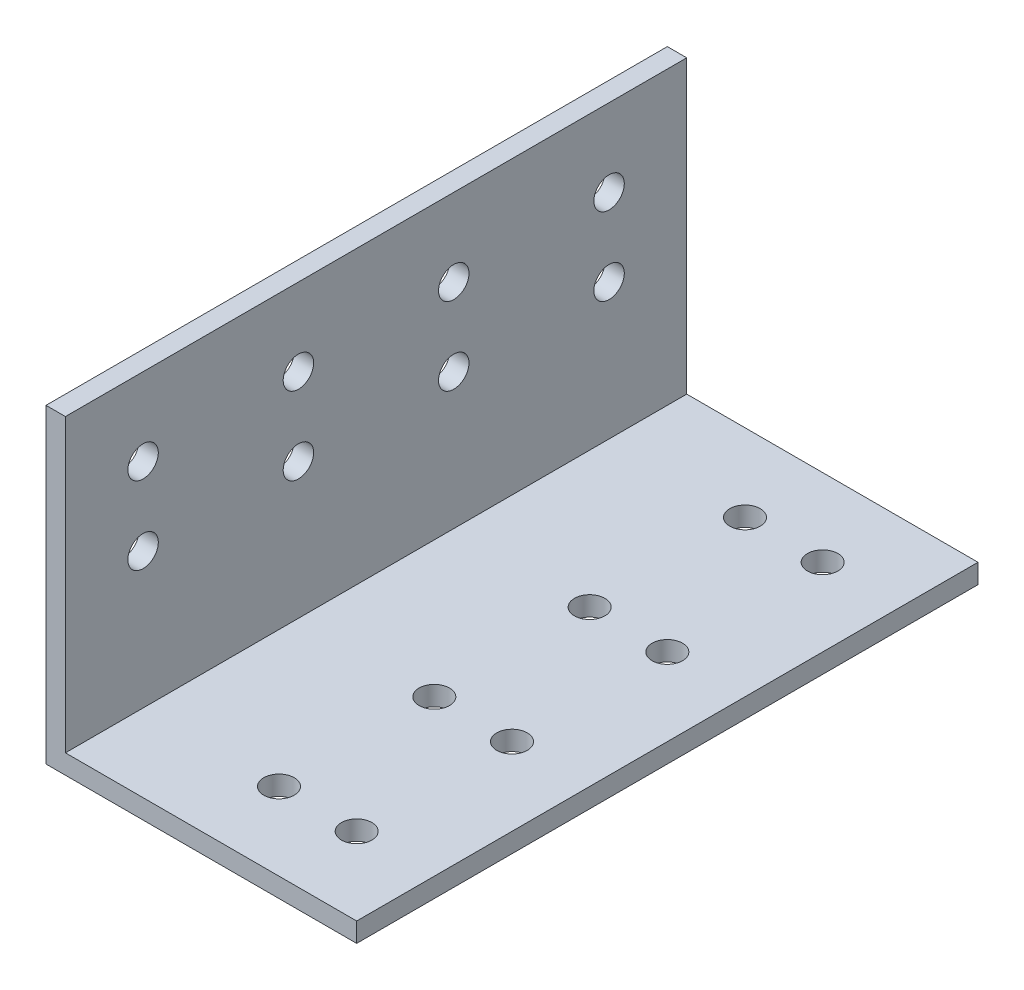
ISO-10303-21;
HEADER;
FILE_DESCRIPTION(('STEP AP214'),'2;1');
FILE_NAME('part.step','',(''),(''),'','','');
FILE_SCHEMA(('AUTOMOTIVE_DESIGN { 1 0 10303 214 1 1 1 1 }'));
ENDSEC;
DATA;
#1=APPLICATION_CONTEXT('core data for automotive mechanical design processes');
#2=APPLICATION_PROTOCOL_DEFINITION('international standard','automotive_design',2000,#1);
#3=PRODUCT_CONTEXT('',#1,'mechanical');
#4=PRODUCT('Part','Part','',(#3));
#5=PRODUCT_RELATED_PRODUCT_CATEGORY('part','',(#4));
#6=PRODUCT_DEFINITION_FORMATION('','',#4);
#7=PRODUCT_DEFINITION_CONTEXT('part definition',#1,'design');
#8=PRODUCT_DEFINITION('design','',#6,#7);
#9=PRODUCT_DEFINITION_SHAPE('','',#8);
#10=(LENGTH_UNIT() NAMED_UNIT(*) SI_UNIT(.MILLI.,.METRE.));
#11=(NAMED_UNIT(*) PLANE_ANGLE_UNIT() SI_UNIT($,.RADIAN.));
#12=(NAMED_UNIT(*) SI_UNIT($,.STERADIAN.) SOLID_ANGLE_UNIT());
#13=UNCERTAINTY_MEASURE_WITH_UNIT(LENGTH_MEASURE(1.E-05),#10,'distance_accuracy_value','');
#14=(GEOMETRIC_REPRESENTATION_CONTEXT(3) GLOBAL_UNCERTAINTY_ASSIGNED_CONTEXT((#13)) GLOBAL_UNIT_ASSIGNED_CONTEXT((#10,
#11,#12)) REPRESENTATION_CONTEXT('',''));
#15=CARTESIAN_POINT('',(0.,0.,0.));
#16=DIRECTION('',(0.,0.,1.));
#17=DIRECTION('',(1.,0.,0.));
#18=AXIS2_PLACEMENT_3D('',#15,#16,#17);
#19=CARTESIAN_POINT('',(0.,50.8,101.6));
#20=DIRECTION('',(0.,1.,0.));
#21=DIRECTION('',(0.,0.,1.));
#22=AXIS2_PLACEMENT_3D('',#19,#20,#21);
#23=PLANE('',#22);
#24=DIRECTION('',(1.,0.,0.));
#25=VECTOR('',#24,1.);
#26=CARTESIAN_POINT('',(0.,50.8,0.));
#27=LINE('',#26,#25);
#28=CARTESIAN_POINT('',(0.,50.8,0.));
#29=VERTEX_POINT('',#28);
#30=CARTESIAN_POINT('',(3.175,50.8,0.));
#31=VERTEX_POINT('',#30);
#32=EDGE_CURVE('E128',#29,#31,#27,.T.);
#33=ORIENTED_EDGE('',*,*,#32,.F.);
#34=DIRECTION('',(0.,0.,-1.));
#35=VECTOR('',#34,1.);
#36=CARTESIAN_POINT('',(0.,50.8,101.6));
#37=LINE('',#36,#35);
#38=CARTESIAN_POINT('',(0.,50.8,101.6));
#39=VERTEX_POINT('',#38);
#40=EDGE_CURVE('E11',#39,#29,#37,.T.);
#41=ORIENTED_EDGE('',*,*,#40,.F.);
#42=DIRECTION('',(1.,0.,0.));
#43=VECTOR('',#42,1.);
#44=CARTESIAN_POINT('',(0.,50.8,101.6));
#45=LINE('',#44,#43);
#46=CARTESIAN_POINT('',(3.175,50.8,101.6));
#47=VERTEX_POINT('',#46);
#48=EDGE_CURVE('E149',#39,#47,#45,.T.);
#49=ORIENTED_EDGE('',*,*,#48,.T.);
#50=DIRECTION('',(0.,0.,-1.));
#51=VECTOR('',#50,1.);
#52=CARTESIAN_POINT('',(3.175,50.8,101.6));
#53=LINE('',#52,#51);
#54=EDGE_CURVE('E39',#47,#31,#53,.T.);
#55=ORIENTED_EDGE('',*,*,#54,.T.);
#56=EDGE_LOOP('',(#33,#41,#49,#55));
#57=FACE_BOUND('',#56,.T.);
#58=ADVANCED_FACE('F36',(#57),#23,.T.);
#59=CARTESIAN_POINT('',(0.,0.,101.6));
#60=DIRECTION('',(-1.,0.,0.));
#61=DIRECTION('',(0.,0.,1.));
#62=AXIS2_PLACEMENT_3D('',#59,#60,#61);
#63=PLANE('',#62);
#64=CARTESIAN_POINT('',(0.,38.0999999999998,38.1));
#65=DIRECTION('',(1.,0.,0.));
#66=DIRECTION('',(0.,1.,0.));
#67=AXIS2_PLACEMENT_3D('',#64,#65,#66);
#68=CIRCLE('',#67,2.4892);
#69=CARTESIAN_POINT('',(0.,40.5891999999998,38.1));
#70=VERTEX_POINT('',#69);
#71=EDGE_CURVE('E426',#70,#70,#68,.T.);
#72=ORIENTED_EDGE('',*,*,#71,.T.);
#73=EDGE_LOOP('',(#72));
#74=FACE_BOUND('',#73,.T.);
#75=CARTESIAN_POINT('',(0.,25.3999999999995,88.9));
#76=DIRECTION('',(1.,0.,0.));
#77=DIRECTION('',(0.,1.,0.));
#78=AXIS2_PLACEMENT_3D('',#75,#76,#77);
#79=CIRCLE('',#78,2.48920000000002);
#80=CARTESIAN_POINT('',(0.,27.8891999999995,88.9));
#81=VERTEX_POINT('',#80);
#82=EDGE_CURVE('E420',#81,#81,#79,.T.);
#83=ORIENTED_EDGE('',*,*,#82,.T.);
#84=EDGE_LOOP('',(#83));
#85=FACE_BOUND('',#84,.T.);
#86=CARTESIAN_POINT('',(0.,25.3999999999996,63.5));
#87=DIRECTION('',(1.,0.,0.));
#88=DIRECTION('',(0.,1.,0.));
#89=AXIS2_PLACEMENT_3D('',#86,#87,#88);
#90=CIRCLE('',#89,2.4892);
#91=CARTESIAN_POINT('',(0.,27.8891999999996,63.5));
#92=VERTEX_POINT('',#91);
#93=EDGE_CURVE('E433',#92,#92,#90,.T.);
#94=ORIENTED_EDGE('',*,*,#93,.T.);
#95=EDGE_LOOP('',(#94));
#96=FACE_BOUND('',#95,.T.);
#97=CARTESIAN_POINT('',(0.,25.3999999999998,38.1));
#98=DIRECTION('',(1.,0.,0.));
#99=DIRECTION('',(0.,1.,0.));
#100=AXIS2_PLACEMENT_3D('',#97,#98,#99);
#101=CIRCLE('',#100,2.4892);
#102=CARTESIAN_POINT('',(0.,27.8891999999998,38.1));
#103=VERTEX_POINT('',#102);
#104=EDGE_CURVE('E222',#103,#103,#101,.T.);
#105=ORIENTED_EDGE('',*,*,#104,.T.);
#106=EDGE_LOOP('',(#105));
#107=FACE_BOUND('',#106,.T.);
#108=CARTESIAN_POINT('',(0.,38.0999999999996,63.5));
#109=DIRECTION('',(1.,0.,0.));
#110=DIRECTION('',(0.,1.,0.));
#111=AXIS2_PLACEMENT_3D('',#108,#109,#110);
#112=CIRCLE('',#111,2.4892);
#113=CARTESIAN_POINT('',(0.,40.5891999999996,63.5));
#114=VERTEX_POINT('',#113);
#115=EDGE_CURVE('E401',#114,#114,#112,.T.);
#116=ORIENTED_EDGE('',*,*,#115,.T.);
#117=EDGE_LOOP('',(#116));
#118=FACE_BOUND('',#117,.T.);
#119=CARTESIAN_POINT('',(0.,38.0999999999995,88.9));
#120=DIRECTION('',(1.,0.,0.));
#121=DIRECTION('',(0.,1.,0.));
#122=AXIS2_PLACEMENT_3D('',#119,#120,#121);
#123=CIRCLE('',#122,2.48920000000002);
#124=CARTESIAN_POINT('',(0.,40.5891999999995,88.9));
#125=VERTEX_POINT('',#124);
#126=EDGE_CURVE('E403',#125,#125,#123,.T.);
#127=ORIENTED_EDGE('',*,*,#126,.T.);
#128=EDGE_LOOP('',(#127));
#129=FACE_BOUND('',#128,.T.);
#130=CARTESIAN_POINT('',(0.,38.1,12.7));
#131=DIRECTION('',(1.,0.,0.));
#132=DIRECTION('',(0.,1.,0.));
#133=AXIS2_PLACEMENT_3D('',#130,#131,#132);
#134=CIRCLE('',#133,2.4892);
#135=CARTESIAN_POINT('',(0.,40.5892,12.7));
#136=VERTEX_POINT('',#135);
#137=EDGE_CURVE('E414',#136,#136,#134,.T.);
#138=ORIENTED_EDGE('',*,*,#137,.T.);
#139=EDGE_LOOP('',(#138));
#140=FACE_BOUND('',#139,.T.);
#141=CARTESIAN_POINT('',(0.,25.4,12.7));
#142=DIRECTION('',(1.,0.,0.));
#143=DIRECTION('',(0.,1.,0.));
#144=AXIS2_PLACEMENT_3D('',#141,#142,#143);
#145=CIRCLE('',#144,2.4892);
#146=CARTESIAN_POINT('',(0.,27.8892,12.7));
#147=VERTEX_POINT('',#146);
#148=EDGE_CURVE('E221',#147,#147,#145,.T.);
#149=ORIENTED_EDGE('',*,*,#148,.T.);
#150=EDGE_LOOP('',(#149));
#151=FACE_BOUND('',#150,.T.);
#152=DIRECTION('',(0.,1.,0.));
#153=VECTOR('',#152,1.);
#154=CARTESIAN_POINT('',(0.,0.,0.));
#155=LINE('',#154,#153);
#156=CARTESIAN_POINT('',(0.,0.,0.));
#157=VERTEX_POINT('',#156);
#158=EDGE_CURVE('E146',#157,#29,#155,.T.);
#159=ORIENTED_EDGE('',*,*,#158,.F.);
#160=DIRECTION('',(0.,0.,-1.));
#161=VECTOR('',#160,1.);
#162=CARTESIAN_POINT('',(0.,0.,101.6));
#163=LINE('',#162,#161);
#164=CARTESIAN_POINT('',(0.,0.,101.6));
#165=VERTEX_POINT('',#164);
#166=EDGE_CURVE('E46',#165,#157,#163,.T.);
#167=ORIENTED_EDGE('',*,*,#166,.F.);
#168=DIRECTION('',(0.,1.,0.));
#169=VECTOR('',#168,1.);
#170=CARTESIAN_POINT('',(0.,0.,101.6));
#171=LINE('',#170,#169);
#172=EDGE_CURVE('E113',#165,#39,#171,.T.);
#173=ORIENTED_EDGE('',*,*,#172,.T.);
#174=ORIENTED_EDGE('',*,*,#40,.T.);
#175=EDGE_LOOP('',(#159,#167,#173,#174));
#176=FACE_BOUND('',#175,.T.);
#177=ADVANCED_FACE('F163',(#74,#85,#96,#107,#118,#129,#140,#151,#176),#63,.T.);
#178=CARTESIAN_POINT('',(50.8,0.,101.6));
#179=DIRECTION('',(0.,-1.,0.));
#180=DIRECTION('',(1.,0.,0.));
#181=AXIS2_PLACEMENT_3D('',#178,#179,#180);
#182=PLANE('',#181);
#183=CARTESIAN_POINT('',(25.4,0.,88.9000000000002));
#184=DIRECTION('',(0.,1.,0.));
#185=DIRECTION('',(-1.,0.,0.));
#186=AXIS2_PLACEMENT_3D('',#183,#184,#185);
#187=CIRCLE('',#186,2.4892);
#188=CARTESIAN_POINT('',(22.9108,0.,88.9000000000002));
#189=VERTEX_POINT('',#188);
#190=EDGE_CURVE('E283',#189,#189,#187,.T.);
#191=ORIENTED_EDGE('',*,*,#190,.T.);
#192=EDGE_LOOP('',(#191));
#193=FACE_BOUND('',#192,.T.);
#194=CARTESIAN_POINT('',(25.4,0.,63.5000000000002));
#195=DIRECTION('',(0.,1.,0.));
#196=DIRECTION('',(-1.,0.,0.));
#197=AXIS2_PLACEMENT_3D('',#194,#195,#196);
#198=CIRCLE('',#197,2.4892);
#199=CARTESIAN_POINT('',(22.9108,0.,63.5000000000002));
#200=VERTEX_POINT('',#199);
#201=EDGE_CURVE('E275',#200,#200,#198,.T.);
#202=ORIENTED_EDGE('',*,*,#201,.T.);
#203=EDGE_LOOP('',(#202));
#204=FACE_BOUND('',#203,.T.);
#205=CARTESIAN_POINT('',(25.4,0.,38.1000000000002));
#206=DIRECTION('',(0.,1.,0.));
#207=DIRECTION('',(-1.,0.,0.));
#208=AXIS2_PLACEMENT_3D('',#205,#206,#207);
#209=CIRCLE('',#208,2.4892);
#210=CARTESIAN_POINT('',(22.9108,0.,38.1000000000002));
#211=VERTEX_POINT('',#210);
#212=EDGE_CURVE('E267',#211,#211,#209,.T.);
#213=ORIENTED_EDGE('',*,*,#212,.T.);
#214=EDGE_LOOP('',(#213));
#215=FACE_BOUND('',#214,.T.);
#216=CARTESIAN_POINT('',(38.1,0.,88.9));
#217=DIRECTION('',(0.,1.,0.));
#218=DIRECTION('',(-1.,0.,0.));
#219=AXIS2_PLACEMENT_3D('',#216,#217,#218);
#220=CIRCLE('',#219,2.4892);
#221=CARTESIAN_POINT('',(35.6108,0.,88.9));
#222=VERTEX_POINT('',#221);
#223=EDGE_CURVE('E259',#222,#222,#220,.T.);
#224=ORIENTED_EDGE('',*,*,#223,.T.);
#225=EDGE_LOOP('',(#224));
#226=FACE_BOUND('',#225,.T.);
#227=CARTESIAN_POINT('',(38.1,0.,63.5));
#228=DIRECTION('',(0.,1.,0.));
#229=DIRECTION('',(-1.,0.,0.));
#230=AXIS2_PLACEMENT_3D('',#227,#228,#229);
#231=CIRCLE('',#230,2.4892);
#232=CARTESIAN_POINT('',(35.6108,0.,63.5));
#233=VERTEX_POINT('',#232);
#234=EDGE_CURVE('E251',#233,#233,#231,.T.);
#235=ORIENTED_EDGE('',*,*,#234,.T.);
#236=EDGE_LOOP('',(#235));
#237=FACE_BOUND('',#236,.T.);
#238=CARTESIAN_POINT('',(38.1,0.,38.1));
#239=DIRECTION('',(0.,1.,0.));
#240=DIRECTION('',(-1.,0.,0.));
#241=AXIS2_PLACEMENT_3D('',#238,#239,#240);
#242=CIRCLE('',#241,2.4892);
#243=CARTESIAN_POINT('',(35.6108,0.,38.1));
#244=VERTEX_POINT('',#243);
#245=EDGE_CURVE('E243',#244,#244,#242,.T.);
#246=ORIENTED_EDGE('',*,*,#245,.T.);
#247=EDGE_LOOP('',(#246));
#248=FACE_BOUND('',#247,.T.);
#249=CARTESIAN_POINT('',(38.1,0.,12.7));
#250=DIRECTION('',(0.,1.,0.));
#251=DIRECTION('',(-1.,0.,0.));
#252=AXIS2_PLACEMENT_3D('',#249,#250,#251);
#253=CIRCLE('',#252,2.4892);
#254=CARTESIAN_POINT('',(35.6108,0.,12.7));
#255=VERTEX_POINT('',#254);
#256=EDGE_CURVE('E234',#255,#255,#253,.T.);
#257=ORIENTED_EDGE('',*,*,#256,.T.);
#258=EDGE_LOOP('',(#257));
#259=FACE_BOUND('',#258,.T.);
#260=CARTESIAN_POINT('',(25.4,0.,12.7000000000002));
#261=DIRECTION('',(0.,1.,0.));
#262=DIRECTION('',(-1.,0.,0.));
#263=AXIS2_PLACEMENT_3D('',#260,#261,#262);
#264=CIRCLE('',#263,2.4892);
#265=CARTESIAN_POINT('',(22.9108,0.,12.7000000000002));
#266=VERTEX_POINT('',#265);
#267=EDGE_CURVE('E133',#266,#266,#264,.T.);
#268=ORIENTED_EDGE('',*,*,#267,.T.);
#269=EDGE_LOOP('',(#268));
#270=FACE_BOUND('',#269,.T.);
#271=DIRECTION('',(-1.,0.,0.));
#272=VECTOR('',#271,1.);
#273=CARTESIAN_POINT('',(50.8,0.,0.));
#274=LINE('',#273,#272);
#275=CARTESIAN_POINT('',(50.8,0.,0.));
#276=VERTEX_POINT('',#275);
#277=EDGE_CURVE('E99',#276,#157,#274,.T.);
#278=ORIENTED_EDGE('',*,*,#277,.F.);
#279=DIRECTION('',(0.,0.,-1.));
#280=VECTOR('',#279,1.);
#281=CARTESIAN_POINT('',(50.8,0.,101.6));
#282=LINE('',#281,#280);
#283=CARTESIAN_POINT('',(50.8,0.,101.6));
#284=VERTEX_POINT('',#283);
#285=EDGE_CURVE('E94',#284,#276,#282,.T.);
#286=ORIENTED_EDGE('',*,*,#285,.F.);
#287=DIRECTION('',(-1.,0.,0.));
#288=VECTOR('',#287,1.);
#289=CARTESIAN_POINT('',(50.8,0.,101.6));
#290=LINE('',#289,#288);
#291=EDGE_CURVE('E97',#284,#165,#290,.T.);
#292=ORIENTED_EDGE('',*,*,#291,.T.);
#293=ORIENTED_EDGE('',*,*,#166,.T.);
#294=EDGE_LOOP('',(#278,#286,#292,#293));
#295=FACE_BOUND('',#294,.T.);
#296=ADVANCED_FACE('F96',(#193,#204,#215,#226,#237,#248,#259,#270,#295),#182,.T.);
#297=CARTESIAN_POINT('',(50.8,3.175,101.6));
#298=DIRECTION('',(1.,0.,0.));
#299=DIRECTION('',(0.,0.,-1.));
#300=AXIS2_PLACEMENT_3D('',#297,#298,#299);
#301=PLANE('',#300);
#302=DIRECTION('',(0.,-1.,0.));
#303=VECTOR('',#302,1.);
#304=CARTESIAN_POINT('',(50.8,3.175,0.));
#305=LINE('',#304,#303);
#306=CARTESIAN_POINT('',(50.8,3.175,0.));
#307=VERTEX_POINT('',#306);
#308=EDGE_CURVE('E141',#307,#276,#305,.T.);
#309=ORIENTED_EDGE('',*,*,#308,.F.);
#310=DIRECTION('',(0.,0.,-1.));
#311=VECTOR('',#310,1.);
#312=CARTESIAN_POINT('',(50.8,3.175,101.6));
#313=LINE('',#312,#311);
#314=CARTESIAN_POINT('',(50.8,3.175,101.6));
#315=VERTEX_POINT('',#314);
#316=EDGE_CURVE('E105',#315,#307,#313,.T.);
#317=ORIENTED_EDGE('',*,*,#316,.F.);
#318=DIRECTION('',(0.,-1.,0.));
#319=VECTOR('',#318,1.);
#320=CARTESIAN_POINT('',(50.8,3.175,101.6));
#321=LINE('',#320,#319);
#322=EDGE_CURVE('E111',#315,#284,#321,.T.);
#323=ORIENTED_EDGE('',*,*,#322,.T.);
#324=ORIENTED_EDGE('',*,*,#285,.T.);
#325=EDGE_LOOP('',(#309,#317,#323,#324));
#326=FACE_BOUND('',#325,.T.);
#327=ADVANCED_FACE('F116',(#326),#301,.T.);
#328=CARTESIAN_POINT('',(3.175,3.175,101.6));
#329=DIRECTION('',(0.,1.,0.));
#330=DIRECTION('',(-1.,0.,0.));
#331=AXIS2_PLACEMENT_3D('',#328,#329,#330);
#332=PLANE('',#331);
#333=CARTESIAN_POINT('',(25.4,3.175,88.9000000000002));
#334=DIRECTION('',(0.,1.,0.));
#335=DIRECTION('',(-1.,0.,0.));
#336=AXIS2_PLACEMENT_3D('',#333,#334,#335);
#337=CIRCLE('',#336,2.4892);
#338=CARTESIAN_POINT('',(22.9108,3.175,88.9000000000002));
#339=VERTEX_POINT('',#338);
#340=EDGE_CURVE('E228',#339,#339,#337,.T.);
#341=ORIENTED_EDGE('',*,*,#340,.F.);
#342=EDGE_LOOP('',(#341));
#343=FACE_BOUND('',#342,.T.);
#344=CARTESIAN_POINT('',(25.4,3.175,63.5000000000002));
#345=DIRECTION('',(0.,1.,0.));
#346=DIRECTION('',(-1.,0.,0.));
#347=AXIS2_PLACEMENT_3D('',#344,#345,#346);
#348=CIRCLE('',#347,2.4892);
#349=CARTESIAN_POINT('',(22.9108,3.175,63.5000000000002));
#350=VERTEX_POINT('',#349);
#351=EDGE_CURVE('E279',#350,#350,#348,.T.);
#352=ORIENTED_EDGE('',*,*,#351,.F.);
#353=EDGE_LOOP('',(#352));
#354=FACE_BOUND('',#353,.T.);
#355=CARTESIAN_POINT('',(25.4,3.175,38.1000000000002));
#356=DIRECTION('',(0.,1.,0.));
#357=DIRECTION('',(-1.,0.,0.));
#358=AXIS2_PLACEMENT_3D('',#355,#356,#357);
#359=CIRCLE('',#358,2.4892);
#360=CARTESIAN_POINT('',(22.9108,3.175,38.1000000000002));
#361=VERTEX_POINT('',#360);
#362=EDGE_CURVE('E271',#361,#361,#359,.T.);
#363=ORIENTED_EDGE('',*,*,#362,.F.);
#364=EDGE_LOOP('',(#363));
#365=FACE_BOUND('',#364,.T.);
#366=CARTESIAN_POINT('',(38.1,3.175,88.9));
#367=DIRECTION('',(0.,1.,0.));
#368=DIRECTION('',(-1.,0.,0.));
#369=AXIS2_PLACEMENT_3D('',#366,#367,#368);
#370=CIRCLE('',#369,2.4892);
#371=CARTESIAN_POINT('',(35.6108,3.175,88.9));
#372=VERTEX_POINT('',#371);
#373=EDGE_CURVE('E263',#372,#372,#370,.T.);
#374=ORIENTED_EDGE('',*,*,#373,.F.);
#375=EDGE_LOOP('',(#374));
#376=FACE_BOUND('',#375,.T.);
#377=CARTESIAN_POINT('',(38.1,3.175,63.5));
#378=DIRECTION('',(0.,1.,0.));
#379=DIRECTION('',(-1.,0.,0.));
#380=AXIS2_PLACEMENT_3D('',#377,#378,#379);
#381=CIRCLE('',#380,2.4892);
#382=CARTESIAN_POINT('',(35.6108,3.175,63.5));
#383=VERTEX_POINT('',#382);
#384=EDGE_CURVE('E255',#383,#383,#381,.T.);
#385=ORIENTED_EDGE('',*,*,#384,.F.);
#386=EDGE_LOOP('',(#385));
#387=FACE_BOUND('',#386,.T.);
#388=CARTESIAN_POINT('',(38.1,3.175,38.1));
#389=DIRECTION('',(0.,1.,0.));
#390=DIRECTION('',(-1.,0.,0.));
#391=AXIS2_PLACEMENT_3D('',#388,#389,#390);
#392=CIRCLE('',#391,2.4892);
#393=CARTESIAN_POINT('',(35.6108,3.175,38.1));
#394=VERTEX_POINT('',#393);
#395=EDGE_CURVE('E247',#394,#394,#392,.T.);
#396=ORIENTED_EDGE('',*,*,#395,.F.);
#397=EDGE_LOOP('',(#396));
#398=FACE_BOUND('',#397,.T.);
#399=CARTESIAN_POINT('',(38.1,3.175,12.7));
#400=DIRECTION('',(0.,1.,0.));
#401=DIRECTION('',(-1.,0.,0.));
#402=AXIS2_PLACEMENT_3D('',#399,#400,#401);
#403=CIRCLE('',#402,2.4892);
#404=CARTESIAN_POINT('',(35.6108,3.175,12.7));
#405=VERTEX_POINT('',#404);
#406=EDGE_CURVE('E239',#405,#405,#403,.T.);
#407=ORIENTED_EDGE('',*,*,#406,.F.);
#408=EDGE_LOOP('',(#407));
#409=FACE_BOUND('',#408,.T.);
#410=CARTESIAN_POINT('',(25.4,3.175,12.7000000000002));
#411=DIRECTION('',(0.,1.,0.));
#412=DIRECTION('',(-1.,0.,0.));
#413=AXIS2_PLACEMENT_3D('',#410,#411,#412);
#414=CIRCLE('',#413,2.4892);
#415=CARTESIAN_POINT('',(22.9108,3.175,12.7000000000002));
#416=VERTEX_POINT('',#415);
#417=EDGE_CURVE('E238',#416,#416,#414,.T.);
#418=ORIENTED_EDGE('',*,*,#417,.F.);
#419=EDGE_LOOP('',(#418));
#420=FACE_BOUND('',#419,.T.);
#421=DIRECTION('',(1.,0.,0.));
#422=VECTOR('',#421,1.);
#423=CARTESIAN_POINT('',(3.175,3.175,0.));
#424=LINE('',#423,#422);
#425=CARTESIAN_POINT('',(3.175,3.175,0.));
#426=VERTEX_POINT('',#425);
#427=EDGE_CURVE('E137',#426,#307,#424,.T.);
#428=ORIENTED_EDGE('',*,*,#427,.F.);
#429=DIRECTION('',(0.,0.,-1.));
#430=VECTOR('',#429,1.);
#431=CARTESIAN_POINT('',(3.175,3.175,101.6));
#432=LINE('',#431,#430);
#433=CARTESIAN_POINT('',(3.175,3.175,101.6));
#434=VERTEX_POINT('',#433);
#435=EDGE_CURVE('E154',#434,#426,#432,.T.);
#436=ORIENTED_EDGE('',*,*,#435,.F.);
#437=DIRECTION('',(1.,0.,0.));
#438=VECTOR('',#437,1.);
#439=CARTESIAN_POINT('',(3.175,3.175,101.6));
#440=LINE('',#439,#438);
#441=EDGE_CURVE('E118',#434,#315,#440,.T.);
#442=ORIENTED_EDGE('',*,*,#441,.T.);
#443=ORIENTED_EDGE('',*,*,#316,.T.);
#444=EDGE_LOOP('',(#428,#436,#442,#443));
#445=FACE_BOUND('',#444,.T.);
#446=ADVANCED_FACE('F180',(#343,#354,#365,#376,#387,#398,#409,#420,#445),#332,.T.);
#447=CARTESIAN_POINT('',(3.175,50.8,101.6));
#448=DIRECTION('',(1.,0.,0.));
#449=DIRECTION('',(0.,1.,0.));
#450=AXIS2_PLACEMENT_3D('',#447,#448,#449);
#451=PLANE('',#450);
#452=CARTESIAN_POINT('',(3.175,38.0999999999998,38.1));
#453=DIRECTION('',(1.,0.,0.));
#454=DIRECTION('',(0.,1.,0.));
#455=AXIS2_PLACEMENT_3D('',#452,#453,#454);
#456=CIRCLE('',#455,2.4892);
#457=CARTESIAN_POINT('',(3.175,40.5891999999998,38.1));
#458=VERTEX_POINT('',#457);
#459=EDGE_CURVE('E191',#458,#458,#456,.T.);
#460=ORIENTED_EDGE('',*,*,#459,.F.);
#461=EDGE_LOOP('',(#460));
#462=FACE_BOUND('',#461,.T.);
#463=CARTESIAN_POINT('',(3.175,25.3999999999995,88.9));
#464=DIRECTION('',(1.,0.,0.));
#465=DIRECTION('',(0.,1.,0.));
#466=AXIS2_PLACEMENT_3D('',#463,#464,#465);
#467=CIRCLE('',#466,2.48920000000002);
#468=CARTESIAN_POINT('',(3.175,27.8891999999995,88.9));
#469=VERTEX_POINT('',#468);
#470=EDGE_CURVE('E195',#469,#469,#467,.T.);
#471=ORIENTED_EDGE('',*,*,#470,.F.);
#472=EDGE_LOOP('',(#471));
#473=FACE_BOUND('',#472,.T.);
#474=CARTESIAN_POINT('',(3.175,25.3999999999996,63.5));
#475=DIRECTION('',(1.,0.,0.));
#476=DIRECTION('',(0.,1.,0.));
#477=AXIS2_PLACEMENT_3D('',#474,#475,#476);
#478=CIRCLE('',#477,2.4892);
#479=CARTESIAN_POINT('',(3.175,27.8891999999996,63.5));
#480=VERTEX_POINT('',#479);
#481=EDGE_CURVE('E199',#480,#480,#478,.T.);
#482=ORIENTED_EDGE('',*,*,#481,.F.);
#483=EDGE_LOOP('',(#482));
#484=FACE_BOUND('',#483,.T.);
#485=CARTESIAN_POINT('',(3.175,25.3999999999998,38.1));
#486=DIRECTION('',(1.,0.,0.));
#487=DIRECTION('',(0.,1.,0.));
#488=AXIS2_PLACEMENT_3D('',#485,#486,#487);
#489=CIRCLE('',#488,2.4892);
#490=CARTESIAN_POINT('',(3.175,27.8891999999998,38.1));
#491=VERTEX_POINT('',#490);
#492=EDGE_CURVE('E203',#491,#491,#489,.T.);
#493=ORIENTED_EDGE('',*,*,#492,.F.);
#494=EDGE_LOOP('',(#493));
#495=FACE_BOUND('',#494,.T.);
#496=CARTESIAN_POINT('',(3.175,38.0999999999996,63.5));
#497=DIRECTION('',(1.,0.,0.));
#498=DIRECTION('',(0.,1.,0.));
#499=AXIS2_PLACEMENT_3D('',#496,#497,#498);
#500=CIRCLE('',#499,2.4892);
#501=CARTESIAN_POINT('',(3.175,40.5891999999996,63.5));
#502=VERTEX_POINT('',#501);
#503=EDGE_CURVE('E207',#502,#502,#500,.T.);
#504=ORIENTED_EDGE('',*,*,#503,.F.);
#505=EDGE_LOOP('',(#504));
#506=FACE_BOUND('',#505,.T.);
#507=CARTESIAN_POINT('',(3.175,38.0999999999995,88.9));
#508=DIRECTION('',(1.,0.,0.));
#509=DIRECTION('',(0.,1.,0.));
#510=AXIS2_PLACEMENT_3D('',#507,#508,#509);
#511=CIRCLE('',#510,2.48920000000002);
#512=CARTESIAN_POINT('',(3.175,40.5891999999995,88.9));
#513=VERTEX_POINT('',#512);
#514=EDGE_CURVE('E211',#513,#513,#511,.T.);
#515=ORIENTED_EDGE('',*,*,#514,.F.);
#516=EDGE_LOOP('',(#515));
#517=FACE_BOUND('',#516,.T.);
#518=CARTESIAN_POINT('',(3.175,38.1,12.7));
#519=DIRECTION('',(1.,0.,0.));
#520=DIRECTION('',(0.,1.,0.));
#521=AXIS2_PLACEMENT_3D('',#518,#519,#520);
#522=CIRCLE('',#521,2.4892);
#523=CARTESIAN_POINT('',(3.175,40.5892,12.7));
#524=VERTEX_POINT('',#523);
#525=EDGE_CURVE('E215',#524,#524,#522,.T.);
#526=ORIENTED_EDGE('',*,*,#525,.F.);
#527=EDGE_LOOP('',(#526));
#528=FACE_BOUND('',#527,.T.);
#529=CARTESIAN_POINT('',(3.175,25.4,12.7));
#530=DIRECTION('',(1.,0.,0.));
#531=DIRECTION('',(0.,1.,0.));
#532=AXIS2_PLACEMENT_3D('',#529,#530,#531);
#533=CIRCLE('',#532,2.4892);
#534=CARTESIAN_POINT('',(3.175,27.8892,12.7));
#535=VERTEX_POINT('',#534);
#536=EDGE_CURVE('E218',#535,#535,#533,.T.);
#537=ORIENTED_EDGE('',*,*,#536,.F.);
#538=EDGE_LOOP('',(#537));
#539=FACE_BOUND('',#538,.T.);
#540=DIRECTION('',(0.,-1.,0.));
#541=VECTOR('',#540,1.);
#542=CARTESIAN_POINT('',(3.175,50.8,0.));
#543=LINE('',#542,#541);
#544=EDGE_CURVE('E132',#31,#426,#543,.T.);
#545=ORIENTED_EDGE('',*,*,#544,.F.);
#546=ORIENTED_EDGE('',*,*,#54,.F.);
#547=DIRECTION('',(0.,-1.,0.));
#548=VECTOR('',#547,1.);
#549=CARTESIAN_POINT('',(3.175,50.8,101.6));
#550=LINE('',#549,#548);
#551=EDGE_CURVE('E122',#47,#434,#550,.T.);
#552=ORIENTED_EDGE('',*,*,#551,.T.);
#553=ORIENTED_EDGE('',*,*,#435,.T.);
#554=EDGE_LOOP('',(#545,#546,#552,#553));
#555=FACE_BOUND('',#554,.T.);
#556=ADVANCED_FACE('F160',(#462,#473,#484,#495,#506,#517,#528,#539,#555),#451,.T.);
#557=CARTESIAN_POINT('',(0.,0.,101.6));
#558=DIRECTION('',(0.,0.,-1.));
#559=DIRECTION('',(-1.,0.,0.));
#560=AXIS2_PLACEMENT_3D('',#557,#558,#559);
#561=PLANE('',#560);
#562=ORIENTED_EDGE('',*,*,#48,.F.);
#563=ORIENTED_EDGE('',*,*,#172,.F.);
#564=ORIENTED_EDGE('',*,*,#291,.F.);
#565=ORIENTED_EDGE('',*,*,#322,.F.);
#566=ORIENTED_EDGE('',*,*,#441,.F.);
#567=ORIENTED_EDGE('',*,*,#551,.F.);
#568=EDGE_LOOP('',(#562,#563,#564,#565,#566,#567));
#569=FACE_BOUND('',#568,.T.);
#570=ADVANCED_FACE('F109',(#569),#561,.F.);
#571=CARTESIAN_POINT('',(0.,0.,0.));
#572=DIRECTION('',(0.,0.,-1.));
#573=DIRECTION('',(-1.,0.,0.));
#574=AXIS2_PLACEMENT_3D('',#571,#572,#573);
#575=PLANE('',#574);
#576=ORIENTED_EDGE('',*,*,#32,.T.);
#577=ORIENTED_EDGE('',*,*,#544,.T.);
#578=ORIENTED_EDGE('',*,*,#427,.T.);
#579=ORIENTED_EDGE('',*,*,#308,.T.);
#580=ORIENTED_EDGE('',*,*,#277,.T.);
#581=ORIENTED_EDGE('',*,*,#158,.T.);
#582=EDGE_LOOP('',(#576,#577,#578,#579,#580,#581));
#583=FACE_BOUND('',#582,.T.);
#584=ADVANCED_FACE('F162',(#583),#575,.T.);
#585=CARTESIAN_POINT('',(25.4,0.,12.7000000000002));
#586=DIRECTION('',(0.,1.,0.));
#587=DIRECTION('',(-1.,0.,0.));
#588=AXIS2_PLACEMENT_3D('',#585,#586,#587);
#589=CYLINDRICAL_SURFACE('',#588,2.4892);
#590=ORIENTED_EDGE('',*,*,#267,.F.);
#591=EDGE_LOOP('',(#590));
#592=FACE_BOUND('',#591,.T.);
#593=ORIENTED_EDGE('',*,*,#417,.T.);
#594=EDGE_LOOP('',(#593));
#595=FACE_BOUND('',#594,.T.);
#596=ADVANCED_FACE('F327',(#592,#595),#589,.F.);
#597=CARTESIAN_POINT('',(38.1,0.,12.7));
#598=DIRECTION('',(0.,1.,0.));
#599=DIRECTION('',(-1.,0.,0.));
#600=AXIS2_PLACEMENT_3D('',#597,#598,#599);
#601=CYLINDRICAL_SURFACE('',#600,2.4892);
#602=ORIENTED_EDGE('',*,*,#256,.F.);
#603=EDGE_LOOP('',(#602));
#604=FACE_BOUND('',#603,.T.);
#605=ORIENTED_EDGE('',*,*,#406,.T.);
#606=EDGE_LOOP('',(#605));
#607=FACE_BOUND('',#606,.T.);
#608=ADVANCED_FACE('F330',(#604,#607),#601,.F.);
#609=CARTESIAN_POINT('',(38.1,0.,38.1));
#610=DIRECTION('',(0.,1.,0.));
#611=DIRECTION('',(-1.,0.,0.));
#612=AXIS2_PLACEMENT_3D('',#609,#610,#611);
#613=CYLINDRICAL_SURFACE('',#612,2.4892);
#614=ORIENTED_EDGE('',*,*,#245,.F.);
#615=EDGE_LOOP('',(#614));
#616=FACE_BOUND('',#615,.T.);
#617=ORIENTED_EDGE('',*,*,#395,.T.);
#618=EDGE_LOOP('',(#617));
#619=FACE_BOUND('',#618,.T.);
#620=ADVANCED_FACE('F337',(#616,#619),#613,.F.);
#621=CARTESIAN_POINT('',(38.1,0.,63.5));
#622=DIRECTION('',(0.,1.,0.));
#623=DIRECTION('',(-1.,0.,0.));
#624=AXIS2_PLACEMENT_3D('',#621,#622,#623);
#625=CYLINDRICAL_SURFACE('',#624,2.4892);
#626=ORIENTED_EDGE('',*,*,#234,.F.);
#627=EDGE_LOOP('',(#626));
#628=FACE_BOUND('',#627,.T.);
#629=ORIENTED_EDGE('',*,*,#384,.T.);
#630=EDGE_LOOP('',(#629));
#631=FACE_BOUND('',#630,.T.);
#632=ADVANCED_FACE('F358',(#628,#631),#625,.F.);
#633=CARTESIAN_POINT('',(38.1,0.,88.9));
#634=DIRECTION('',(0.,1.,0.));
#635=DIRECTION('',(-1.,0.,0.));
#636=AXIS2_PLACEMENT_3D('',#633,#634,#635);
#637=CYLINDRICAL_SURFACE('',#636,2.4892);
#638=ORIENTED_EDGE('',*,*,#223,.F.);
#639=EDGE_LOOP('',(#638));
#640=FACE_BOUND('',#639,.T.);
#641=ORIENTED_EDGE('',*,*,#373,.T.);
#642=EDGE_LOOP('',(#641));
#643=FACE_BOUND('',#642,.T.);
#644=ADVANCED_FACE('F354',(#640,#643),#637,.F.);
#645=CARTESIAN_POINT('',(25.4,0.,38.1000000000002));
#646=DIRECTION('',(0.,1.,0.));
#647=DIRECTION('',(-1.,0.,0.));
#648=AXIS2_PLACEMENT_3D('',#645,#646,#647);
#649=CYLINDRICAL_SURFACE('',#648,2.4892);
#650=ORIENTED_EDGE('',*,*,#212,.F.);
#651=EDGE_LOOP('',(#650));
#652=FACE_BOUND('',#651,.T.);
#653=ORIENTED_EDGE('',*,*,#362,.T.);
#654=EDGE_LOOP('',(#653));
#655=FACE_BOUND('',#654,.T.);
#656=ADVANCED_FACE('F350',(#652,#655),#649,.F.);
#657=CARTESIAN_POINT('',(25.4,0.,63.5000000000002));
#658=DIRECTION('',(0.,1.,0.));
#659=DIRECTION('',(-1.,0.,0.));
#660=AXIS2_PLACEMENT_3D('',#657,#658,#659);
#661=CYLINDRICAL_SURFACE('',#660,2.4892);
#662=ORIENTED_EDGE('',*,*,#201,.F.);
#663=EDGE_LOOP('',(#662));
#664=FACE_BOUND('',#663,.T.);
#665=ORIENTED_EDGE('',*,*,#351,.T.);
#666=EDGE_LOOP('',(#665));
#667=FACE_BOUND('',#666,.T.);
#668=ADVANCED_FACE('F346',(#664,#667),#661,.F.);
#669=CARTESIAN_POINT('',(25.4,0.,88.9000000000002));
#670=DIRECTION('',(0.,1.,0.));
#671=DIRECTION('',(-1.,0.,0.));
#672=AXIS2_PLACEMENT_3D('',#669,#670,#671);
#673=CYLINDRICAL_SURFACE('',#672,2.4892);
#674=ORIENTED_EDGE('',*,*,#190,.F.);
#675=EDGE_LOOP('',(#674));
#676=FACE_BOUND('',#675,.T.);
#677=ORIENTED_EDGE('',*,*,#340,.T.);
#678=EDGE_LOOP('',(#677));
#679=FACE_BOUND('',#678,.T.);
#680=ADVANCED_FACE('F342',(#676,#679),#673,.F.);
#681=CARTESIAN_POINT('',(0.,25.4,12.7));
#682=DIRECTION('',(1.,0.,0.));
#683=DIRECTION('',(0.,1.,0.));
#684=AXIS2_PLACEMENT_3D('',#681,#682,#683);
#685=CYLINDRICAL_SURFACE('',#684,2.4892);
#686=ORIENTED_EDGE('',*,*,#148,.F.);
#687=EDGE_LOOP('',(#686));
#688=FACE_BOUND('',#687,.T.);
#689=ORIENTED_EDGE('',*,*,#536,.T.);
#690=EDGE_LOOP('',(#689));
#691=FACE_BOUND('',#690,.T.);
#692=ADVANCED_FACE('F345',(#688,#691),#685,.F.);
#693=CARTESIAN_POINT('',(0.,38.1,12.7));
#694=DIRECTION('',(1.,0.,0.));
#695=DIRECTION('',(0.,1.,0.));
#696=AXIS2_PLACEMENT_3D('',#693,#694,#695);
#697=CYLINDRICAL_SURFACE('',#696,2.4892);
#698=ORIENTED_EDGE('',*,*,#137,.F.);
#699=EDGE_LOOP('',(#698));
#700=FACE_BOUND('',#699,.T.);
#701=ORIENTED_EDGE('',*,*,#525,.T.);
#702=EDGE_LOOP('',(#701));
#703=FACE_BOUND('',#702,.T.);
#704=ADVANCED_FACE('F368',(#700,#703),#697,.F.);
#705=CARTESIAN_POINT('',(0.,38.0999999999995,88.9));
#706=DIRECTION('',(1.,0.,0.));
#707=DIRECTION('',(0.,1.,0.));
#708=AXIS2_PLACEMENT_3D('',#705,#706,#707);
#709=CYLINDRICAL_SURFACE('',#708,2.48920000000002);
#710=ORIENTED_EDGE('',*,*,#126,.F.);
#711=EDGE_LOOP('',(#710));
#712=FACE_BOUND('',#711,.T.);
#713=ORIENTED_EDGE('',*,*,#514,.T.);
#714=EDGE_LOOP('',(#713));
#715=FACE_BOUND('',#714,.T.);
#716=ADVANCED_FACE('F389',(#712,#715),#709,.F.);
#717=CARTESIAN_POINT('',(0.,38.0999999999996,63.5));
#718=DIRECTION('',(1.,0.,0.));
#719=DIRECTION('',(0.,1.,0.));
#720=AXIS2_PLACEMENT_3D('',#717,#718,#719);
#721=CYLINDRICAL_SURFACE('',#720,2.4892);
#722=ORIENTED_EDGE('',*,*,#115,.F.);
#723=EDGE_LOOP('',(#722));
#724=FACE_BOUND('',#723,.T.);
#725=ORIENTED_EDGE('',*,*,#503,.T.);
#726=EDGE_LOOP('',(#725));
#727=FACE_BOUND('',#726,.T.);
#728=ADVANCED_FACE('F378',(#724,#727),#721,.F.);
#729=CARTESIAN_POINT('',(0.,25.3999999999998,38.1));
#730=DIRECTION('',(1.,0.,0.));
#731=DIRECTION('',(0.,1.,0.));
#732=AXIS2_PLACEMENT_3D('',#729,#730,#731);
#733=CYLINDRICAL_SURFACE('',#732,2.4892);
#734=ORIENTED_EDGE('',*,*,#104,.F.);
#735=EDGE_LOOP('',(#734));
#736=FACE_BOUND('',#735,.T.);
#737=ORIENTED_EDGE('',*,*,#492,.T.);
#738=EDGE_LOOP('',(#737));
#739=FACE_BOUND('',#738,.T.);
#740=ADVANCED_FACE('F374',(#736,#739),#733,.F.);
#741=CARTESIAN_POINT('',(0.,25.3999999999996,63.5));
#742=DIRECTION('',(1.,0.,0.));
#743=DIRECTION('',(0.,1.,0.));
#744=AXIS2_PLACEMENT_3D('',#741,#742,#743);
#745=CYLINDRICAL_SURFACE('',#744,2.4892);
#746=ORIENTED_EDGE('',*,*,#93,.F.);
#747=EDGE_LOOP('',(#746));
#748=FACE_BOUND('',#747,.T.);
#749=ORIENTED_EDGE('',*,*,#481,.T.);
#750=EDGE_LOOP('',(#749));
#751=FACE_BOUND('',#750,.T.);
#752=ADVANCED_FACE('F370',(#748,#751),#745,.F.);
#753=CARTESIAN_POINT('',(0.,25.3999999999995,88.9));
#754=DIRECTION('',(1.,0.,0.));
#755=DIRECTION('',(0.,1.,0.));
#756=AXIS2_PLACEMENT_3D('',#753,#754,#755);
#757=CYLINDRICAL_SURFACE('',#756,2.48920000000002);
#758=ORIENTED_EDGE('',*,*,#82,.F.);
#759=EDGE_LOOP('',(#758));
#760=FACE_BOUND('',#759,.T.);
#761=ORIENTED_EDGE('',*,*,#470,.T.);
#762=EDGE_LOOP('',(#761));
#763=FACE_BOUND('',#762,.T.);
#764=ADVANCED_FACE('F373',(#760,#763),#757,.F.);
#765=CARTESIAN_POINT('',(0.,38.0999999999998,38.1));
#766=DIRECTION('',(1.,0.,0.));
#767=DIRECTION('',(0.,1.,0.));
#768=AXIS2_PLACEMENT_3D('',#765,#766,#767);
#769=CYLINDRICAL_SURFACE('',#768,2.4892);
#770=ORIENTED_EDGE('',*,*,#71,.F.);
#771=EDGE_LOOP('',(#770));
#772=FACE_BOUND('',#771,.T.);
#773=ORIENTED_EDGE('',*,*,#459,.T.);
#774=EDGE_LOOP('',(#773));
#775=FACE_BOUND('',#774,.T.);
#776=ADVANCED_FACE('F380',(#772,#775),#769,.F.);
#777=CLOSED_SHELL('',(#58,#177,#296,#327,#446,#556,#570,#584,#596,#608,#620,#632,#644,#656,#668,
#680,#692,#704,#716,#728,#740,#752,#764,#776));
#778=MANIFOLD_SOLID_BREP('B2',#777);
#779=ADVANCED_BREP_SHAPE_REPRESENTATION('',(#18,#778),#14);
#780=SHAPE_DEFINITION_REPRESENTATION(#9,#779);
ENDSEC;
END-ISO-10303-21;
